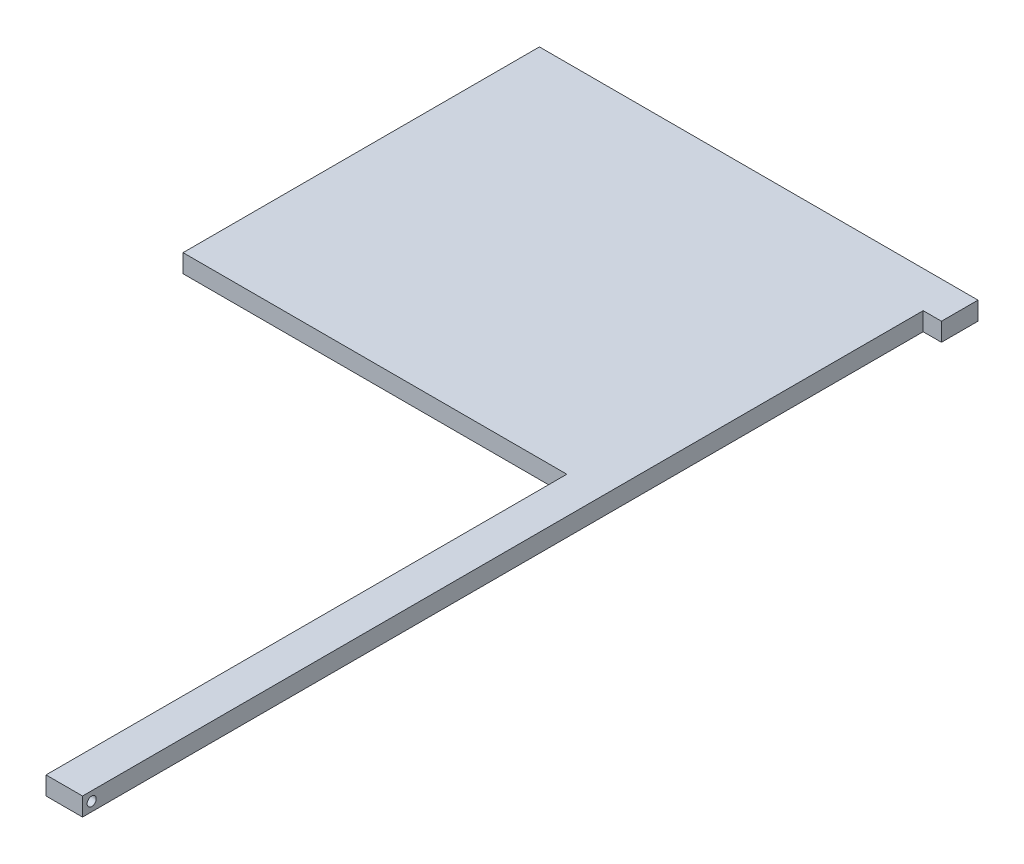
ISO-10303-21;
HEADER;
FILE_DESCRIPTION(('STEP AP214'),'2;1');
FILE_NAME('part.step','',(''),(''),'','','');
FILE_SCHEMA(('AUTOMOTIVE_DESIGN { 1 0 10303 214 1 1 1 1 }'));
ENDSEC;
DATA;
#1=APPLICATION_CONTEXT('core data for automotive mechanical design processes');
#2=APPLICATION_PROTOCOL_DEFINITION('international standard','automotive_design',2000,#1);
#3=PRODUCT_CONTEXT('',#1,'mechanical');
#4=PRODUCT('Part','Part','',(#3));
#5=PRODUCT_RELATED_PRODUCT_CATEGORY('part','',(#4));
#6=PRODUCT_DEFINITION_FORMATION('','',#4);
#7=PRODUCT_DEFINITION_CONTEXT('part definition',#1,'design');
#8=PRODUCT_DEFINITION('design','',#6,#7);
#9=PRODUCT_DEFINITION_SHAPE('','',#8);
#10=(LENGTH_UNIT() NAMED_UNIT(*) SI_UNIT(.MILLI.,.METRE.));
#11=(NAMED_UNIT(*) PLANE_ANGLE_UNIT() SI_UNIT($,.RADIAN.));
#12=(NAMED_UNIT(*) SI_UNIT($,.STERADIAN.) SOLID_ANGLE_UNIT());
#13=UNCERTAINTY_MEASURE_WITH_UNIT(LENGTH_MEASURE(1.E-05),#10,'distance_accuracy_value','');
#14=(GEOMETRIC_REPRESENTATION_CONTEXT(3) GLOBAL_UNCERTAINTY_ASSIGNED_CONTEXT((#13)) GLOBAL_UNIT_ASSIGNED_CONTEXT((#10,
#11,#12)) REPRESENTATION_CONTEXT('',''));
#15=CARTESIAN_POINT('',(0.,0.,0.));
#16=DIRECTION('',(0.,0.,1.));
#17=DIRECTION('',(1.,0.,0.));
#18=AXIS2_PLACEMENT_3D('',#15,#16,#17);
#19=CARTESIAN_POINT('',(241.3,12.7,-152.4));
#20=DIRECTION('',(-1.,0.,0.));
#21=DIRECTION('',(0.,0.,1.));
#22=AXIS2_PLACEMENT_3D('',#19,#20,#21);
#23=PLANE('',#22);
#24=CARTESIAN_POINT('',(241.3,15.875,149.225));
#25=DIRECTION('',(-1.,0.,0.));
#26=DIRECTION('',(0.,0.,1.));
#27=AXIS2_PLACEMENT_3D('',#24,#25,#26);
#28=CIRCLE('',#27,1.58749999999999);
#29=CARTESIAN_POINT('',(241.3,15.875,150.8125));
#30=VERTEX_POINT('',#29);
#31=EDGE_CURVE('E161',#30,#30,#28,.T.);
#32=ORIENTED_EDGE('',*,*,#31,.T.);
#33=EDGE_LOOP('',(#32));
#34=FACE_BOUND('',#33,.T.);
#35=DIRECTION('',(0.,0.,1.));
#36=VECTOR('',#35,1.);
#37=CARTESIAN_POINT('',(241.3,12.7,-139.7));
#38=LINE('',#37,#36);
#39=CARTESIAN_POINT('',(241.3,12.7,-139.7));
#40=VERTEX_POINT('',#39);
#41=CARTESIAN_POINT('',(241.3,12.7,152.4));
#42=VERTEX_POINT('',#41);
#43=EDGE_CURVE('E166',#40,#42,#38,.T.);
#44=ORIENTED_EDGE('',*,*,#43,.F.);
#45=DIRECTION('',(0.,1.,0.));
#46=VECTOR('',#45,1.);
#47=CARTESIAN_POINT('',(241.3,19.05,-139.7));
#48=LINE('',#47,#46);
#49=CARTESIAN_POINT('',(241.3,19.05,-139.7));
#50=VERTEX_POINT('',#49);
#51=EDGE_CURVE('E67',#40,#50,#48,.T.);
#52=ORIENTED_EDGE('',*,*,#51,.T.);
#53=DIRECTION('',(0.,0.,-1.));
#54=VECTOR('',#53,1.);
#55=CARTESIAN_POINT('',(241.3,19.05,-152.4));
#56=LINE('',#55,#54);
#57=CARTESIAN_POINT('',(241.3,19.05,152.4));
#58=VERTEX_POINT('',#57);
#59=EDGE_CURVE('E134',#58,#50,#56,.T.);
#60=ORIENTED_EDGE('',*,*,#59,.F.);
#61=DIRECTION('',(0.,-1.,0.));
#62=VECTOR('',#61,1.);
#63=CARTESIAN_POINT('',(241.3,12.7,152.4));
#64=LINE('',#63,#62);
#65=EDGE_CURVE('E53',#58,#42,#64,.T.);
#66=ORIENTED_EDGE('',*,*,#65,.T.);
#67=EDGE_LOOP('',(#44,#52,#60,#66));
#68=FACE_BOUND('',#67,.T.);
#69=ADVANCED_FACE('F45',(#34,#68),#23,.F.);
#70=CARTESIAN_POINT('',(-241.3,12.7,-152.4));
#71=DIRECTION('',(0.,0.,1.));
#72=DIRECTION('',(1.,0.,0.));
#73=AXIS2_PLACEMENT_3D('',#70,#71,#72);
#74=PLANE('',#73);
#75=DIRECTION('',(-1.,0.,0.));
#76=VECTOR('',#75,1.);
#77=CARTESIAN_POINT('',(247.65,12.7,-152.4));
#78=LINE('',#77,#76);
#79=CARTESIAN_POINT('',(247.65,12.7,-152.4));
#80=VERTEX_POINT('',#79);
#81=CARTESIAN_POINT('',(95.25,12.7,-152.4));
#82=VERTEX_POINT('',#81);
#83=EDGE_CURVE('E124',#80,#82,#78,.T.);
#84=ORIENTED_EDGE('',*,*,#83,.T.);
#85=DIRECTION('',(0.,1.,0.));
#86=VECTOR('',#85,1.);
#87=CARTESIAN_POINT('',(95.25,12.7,-152.4));
#88=LINE('',#87,#86);
#89=CARTESIAN_POINT('',(95.25,19.05,-152.4));
#90=VERTEX_POINT('',#89);
#91=EDGE_CURVE('E60',#82,#90,#88,.T.);
#92=ORIENTED_EDGE('',*,*,#91,.T.);
#93=DIRECTION('',(-1.,0.,0.));
#94=VECTOR('',#93,1.);
#95=CARTESIAN_POINT('',(241.3,19.05,-152.4));
#96=LINE('',#95,#94);
#97=CARTESIAN_POINT('',(247.65,19.05,-152.4));
#98=VERTEX_POINT('',#97);
#99=EDGE_CURVE('E122',#98,#90,#96,.T.);
#100=ORIENTED_EDGE('',*,*,#99,.F.);
#101=DIRECTION('',(0.,-1.,0.));
#102=VECTOR('',#101,1.);
#103=CARTESIAN_POINT('',(247.65,19.05,-152.4));
#104=LINE('',#103,#102);
#105=EDGE_CURVE('E203',#98,#80,#104,.T.);
#106=ORIENTED_EDGE('',*,*,#105,.T.);
#107=EDGE_LOOP('',(#84,#92,#100,#106));
#108=FACE_BOUND('',#107,.T.);
#109=ADVANCED_FACE('F120',(#108),#74,.F.);
#110=CARTESIAN_POINT('',(-241.3,12.7,152.4));
#111=DIRECTION('',(0.,0.,-1.));
#112=DIRECTION('',(-1.,0.,0.));
#113=AXIS2_PLACEMENT_3D('',#110,#111,#112);
#114=PLANE('',#113);
#115=DIRECTION('',(0.,-1.,0.));
#116=VECTOR('',#115,1.);
#117=CARTESIAN_POINT('',(228.6,19.05,152.4));
#118=LINE('',#117,#116);
#119=CARTESIAN_POINT('',(228.6,19.05,152.4));
#120=VERTEX_POINT('',#119);
#121=CARTESIAN_POINT('',(228.6,12.7,152.4));
#122=VERTEX_POINT('',#121);
#123=EDGE_CURVE('E133',#120,#122,#118,.T.);
#124=ORIENTED_EDGE('',*,*,#123,.T.);
#125=DIRECTION('',(-1.,0.,0.));
#126=VECTOR('',#125,1.);
#127=CARTESIAN_POINT('',(247.65,12.7,152.4));
#128=LINE('',#127,#126);
#129=EDGE_CURVE('E188',#42,#122,#128,.T.);
#130=ORIENTED_EDGE('',*,*,#129,.F.);
#131=ORIENTED_EDGE('',*,*,#65,.F.);
#132=DIRECTION('',(1.,0.,0.));
#133=VECTOR('',#132,1.);
#134=CARTESIAN_POINT('',(241.3,19.05,152.4));
#135=LINE('',#134,#133);
#136=EDGE_CURVE('E141',#120,#58,#135,.T.);
#137=ORIENTED_EDGE('',*,*,#136,.F.);
#138=EDGE_LOOP('',(#124,#130,#131,#137));
#139=FACE_BOUND('',#138,.T.);
#140=ADVANCED_FACE('F187',(#139),#114,.F.);
#141=CARTESIAN_POINT('',(-228.6,19.05,-28.575));
#142=DIRECTION('',(0.,0.,-1.));
#143=DIRECTION('',(-1.,0.,0.));
#144=AXIS2_PLACEMENT_3D('',#141,#142,#143);
#145=PLANE('',#144);
#146=DIRECTION('',(1.,0.,0.));
#147=VECTOR('',#146,1.);
#148=CARTESIAN_POINT('',(-228.6,19.05,-28.575));
#149=LINE('',#148,#147);
#150=CARTESIAN_POINT('',(95.25,19.05,-28.575));
#151=VERTEX_POINT('',#150);
#152=CARTESIAN_POINT('',(228.6,19.05,-28.575));
#153=VERTEX_POINT('',#152);
#154=EDGE_CURVE('E152',#151,#153,#149,.T.);
#155=ORIENTED_EDGE('',*,*,#154,.F.);
#156=DIRECTION('',(0.,-1.,0.));
#157=VECTOR('',#156,1.);
#158=CARTESIAN_POINT('',(95.25,19.05,-28.575));
#159=LINE('',#158,#157);
#160=CARTESIAN_POINT('',(95.25,12.7,-28.575));
#161=VERTEX_POINT('',#160);
#162=EDGE_CURVE('E112',#151,#161,#159,.T.);
#163=ORIENTED_EDGE('',*,*,#162,.T.);
#164=DIRECTION('',(1.,0.,0.));
#165=VECTOR('',#164,1.);
#166=CARTESIAN_POINT('',(-228.6,12.7,-28.575));
#167=LINE('',#166,#165);
#168=CARTESIAN_POINT('',(228.6,12.7,-28.575));
#169=VERTEX_POINT('',#168);
#170=EDGE_CURVE('E145',#161,#169,#167,.T.);
#171=ORIENTED_EDGE('',*,*,#170,.T.);
#172=DIRECTION('',(0.,-1.,0.));
#173=VECTOR('',#172,1.);
#174=CARTESIAN_POINT('',(228.6,19.05,-28.575));
#175=LINE('',#174,#173);
#176=EDGE_CURVE('E139',#153,#169,#175,.T.);
#177=ORIENTED_EDGE('',*,*,#176,.F.);
#178=EDGE_LOOP('',(#155,#163,#171,#177));
#179=FACE_BOUND('',#178,.T.);
#180=ADVANCED_FACE('F222',(#179),#145,.F.);
#181=CARTESIAN_POINT('',(228.6,19.05,-28.575));
#182=DIRECTION('',(1.,0.,0.));
#183=DIRECTION('',(0.,0.,-1.));
#184=AXIS2_PLACEMENT_3D('',#181,#182,#183);
#185=PLANE('',#184);
#186=CARTESIAN_POINT('',(228.6,15.875,149.225));
#187=DIRECTION('',(1.,0.,0.));
#188=DIRECTION('',(0.,0.,-1.));
#189=AXIS2_PLACEMENT_3D('',#186,#187,#188);
#190=CIRCLE('',#189,1.58749999999999);
#191=CARTESIAN_POINT('',(228.6,15.875,147.6375));
#192=VERTEX_POINT('',#191);
#193=EDGE_CURVE('E149',#192,#192,#190,.T.);
#194=ORIENTED_EDGE('',*,*,#193,.T.);
#195=EDGE_LOOP('',(#194));
#196=FACE_BOUND('',#195,.T.);
#197=DIRECTION('',(0.,0.,1.));
#198=VECTOR('',#197,1.);
#199=CARTESIAN_POINT('',(228.6,12.7,-28.575));
#200=LINE('',#199,#198);
#201=EDGE_CURVE('E148',#169,#122,#200,.T.);
#202=ORIENTED_EDGE('',*,*,#201,.T.);
#203=ORIENTED_EDGE('',*,*,#123,.F.);
#204=DIRECTION('',(0.,0.,1.));
#205=VECTOR('',#204,1.);
#206=CARTESIAN_POINT('',(228.6,19.05,-28.575));
#207=LINE('',#206,#205);
#208=EDGE_CURVE('E177',#153,#120,#207,.T.);
#209=ORIENTED_EDGE('',*,*,#208,.F.);
#210=ORIENTED_EDGE('',*,*,#176,.T.);
#211=EDGE_LOOP('',(#202,#203,#209,#210));
#212=FACE_BOUND('',#211,.T.);
#213=ADVANCED_FACE('F227',(#196,#212),#185,.F.);
#214=CARTESIAN_POINT('',(0.,19.05,0.));
#215=DIRECTION('',(0.,1.,0.));
#216=DIRECTION('',(0.,0.,1.));
#217=AXIS2_PLACEMENT_3D('',#214,#215,#216);
#218=PLANE('',#217);
#219=DIRECTION('',(0.,0.,-1.));
#220=VECTOR('',#219,1.);
#221=CARTESIAN_POINT('',(95.25,19.05,-152.4));
#222=LINE('',#221,#220);
#223=EDGE_CURVE('E109',#151,#90,#222,.T.);
#224=ORIENTED_EDGE('',*,*,#223,.F.);
#225=ORIENTED_EDGE('',*,*,#154,.T.);
#226=ORIENTED_EDGE('',*,*,#208,.T.);
#227=ORIENTED_EDGE('',*,*,#136,.T.);
#228=ORIENTED_EDGE('',*,*,#59,.T.);
#229=DIRECTION('',(-1.,0.,0.));
#230=VECTOR('',#229,1.);
#231=CARTESIAN_POINT('',(753.145250599196,19.05,-139.7));
#232=LINE('',#231,#230);
#233=CARTESIAN_POINT('',(247.65,19.05,-139.7));
#234=VERTEX_POINT('',#233);
#235=EDGE_CURVE('E208',#234,#50,#232,.T.);
#236=ORIENTED_EDGE('',*,*,#235,.F.);
#237=DIRECTION('',(0.,0.,-1.));
#238=VECTOR('',#237,1.);
#239=CARTESIAN_POINT('',(247.65,19.05,-152.4));
#240=LINE('',#239,#238);
#241=EDGE_CURVE('E131',#234,#98,#240,.T.);
#242=ORIENTED_EDGE('',*,*,#241,.T.);
#243=ORIENTED_EDGE('',*,*,#99,.T.);
#244=EDGE_LOOP('',(#224,#225,#226,#227,#228,#236,#242,#243));
#245=FACE_BOUND('',#244,.T.);
#246=ADVANCED_FACE('F128',(#245),#218,.T.);
#247=CARTESIAN_POINT('',(241.3,15.875,149.225));
#248=DIRECTION('',(-1.,0.,0.));
#249=DIRECTION('',(0.,0.,1.));
#250=AXIS2_PLACEMENT_3D('',#247,#248,#249);
#251=CYLINDRICAL_SURFACE('',#250,1.58749999999999);
#252=ORIENTED_EDGE('',*,*,#31,.F.);
#253=EDGE_LOOP('',(#252));
#254=FACE_BOUND('',#253,.T.);
#255=ORIENTED_EDGE('',*,*,#193,.F.);
#256=EDGE_LOOP('',(#255));
#257=FACE_BOUND('',#256,.T.);
#258=ADVANCED_FACE('F234',(#254,#257),#251,.F.);
#259=CARTESIAN_POINT('',(247.65,12.7,-139.7));
#260=DIRECTION('',(-1.,0.,0.));
#261=DIRECTION('',(0.,0.,1.));
#262=AXIS2_PLACEMENT_3D('',#259,#260,#261);
#263=PLANE('',#262);
#264=DIRECTION('',(0.,1.,0.));
#265=VECTOR('',#264,1.);
#266=CARTESIAN_POINT('',(247.65,19.05,-139.7));
#267=LINE('',#266,#265);
#268=CARTESIAN_POINT('',(247.65,12.7,-139.7));
#269=VERTEX_POINT('',#268);
#270=EDGE_CURVE('E202',#269,#234,#267,.T.);
#271=ORIENTED_EDGE('',*,*,#270,.F.);
#272=DIRECTION('',(0.,0.,-1.));
#273=VECTOR('',#272,1.);
#274=CARTESIAN_POINT('',(247.65,12.7,152.4));
#275=LINE('',#274,#273);
#276=EDGE_CURVE('E192',#269,#80,#275,.T.);
#277=ORIENTED_EDGE('',*,*,#276,.T.);
#278=ORIENTED_EDGE('',*,*,#105,.F.);
#279=ORIENTED_EDGE('',*,*,#241,.F.);
#280=EDGE_LOOP('',(#271,#277,#278,#279));
#281=FACE_BOUND('',#280,.T.);
#282=ADVANCED_FACE('F218',(#281),#263,.F.);
#283=CARTESIAN_POINT('',(753.145250599196,19.05,-139.7));
#284=DIRECTION('',(0.,0.,1.));
#285=DIRECTION('',(1.,0.,0.));
#286=AXIS2_PLACEMENT_3D('',#283,#284,#285);
#287=PLANE('',#286);
#288=DIRECTION('',(1.,0.,0.));
#289=VECTOR('',#288,1.);
#290=CARTESIAN_POINT('',(241.3,12.7,-139.7));
#291=LINE('',#290,#289);
#292=EDGE_CURVE('E171',#40,#269,#291,.T.);
#293=ORIENTED_EDGE('',*,*,#292,.T.);
#294=ORIENTED_EDGE('',*,*,#270,.T.);
#295=ORIENTED_EDGE('',*,*,#235,.T.);
#296=ORIENTED_EDGE('',*,*,#51,.F.);
#297=EDGE_LOOP('',(#293,#294,#295,#296));
#298=FACE_BOUND('',#297,.T.);
#299=ADVANCED_FACE('F216',(#298),#287,.T.);
#300=CARTESIAN_POINT('',(247.65,12.7,152.4));
#301=DIRECTION('',(0.,1.,0.));
#302=DIRECTION('',(0.,0.,1.));
#303=AXIS2_PLACEMENT_3D('',#300,#301,#302);
#304=PLANE('',#303);
#305=ORIENTED_EDGE('',*,*,#170,.F.);
#306=DIRECTION('',(0.,0.,-1.));
#307=VECTOR('',#306,1.);
#308=CARTESIAN_POINT('',(95.25,12.7,152.4));
#309=LINE('',#308,#307);
#310=EDGE_CURVE('E11',#161,#82,#309,.T.);
#311=ORIENTED_EDGE('',*,*,#310,.T.);
#312=ORIENTED_EDGE('',*,*,#83,.F.);
#313=ORIENTED_EDGE('',*,*,#276,.F.);
#314=ORIENTED_EDGE('',*,*,#292,.F.);
#315=ORIENTED_EDGE('',*,*,#43,.T.);
#316=ORIENTED_EDGE('',*,*,#129,.T.);
#317=ORIENTED_EDGE('',*,*,#201,.F.);
#318=EDGE_LOOP('',(#305,#311,#312,#313,#314,#315,#316,#317));
#319=FACE_BOUND('',#318,.T.);
#320=ADVANCED_FACE('F220',(#319),#304,.F.);
#321=CARTESIAN_POINT('',(95.25,12.7,-152.4));
#322=DIRECTION('',(1.,0.,0.));
#323=DIRECTION('',(0.,0.,-1.));
#324=AXIS2_PLACEMENT_3D('',#321,#322,#323);
#325=PLANE('',#324);
#326=ORIENTED_EDGE('',*,*,#223,.T.);
#327=ORIENTED_EDGE('',*,*,#91,.F.);
#328=ORIENTED_EDGE('',*,*,#310,.F.);
#329=ORIENTED_EDGE('',*,*,#162,.F.);
#330=EDGE_LOOP('',(#326,#327,#328,#329));
#331=FACE_BOUND('',#330,.T.);
#332=ADVANCED_FACE('F110',(#331),#325,.F.);
#333=CLOSED_SHELL('',(#69,#109,#140,#180,#213,#246,#258,#282,#299,#320,#332));
#334=MANIFOLD_SOLID_BREP('B2',#333);
#335=ADVANCED_BREP_SHAPE_REPRESENTATION('',(#18,#334),#14);
#336=SHAPE_DEFINITION_REPRESENTATION(#9,#335);
ENDSEC;
END-ISO-10303-21;
